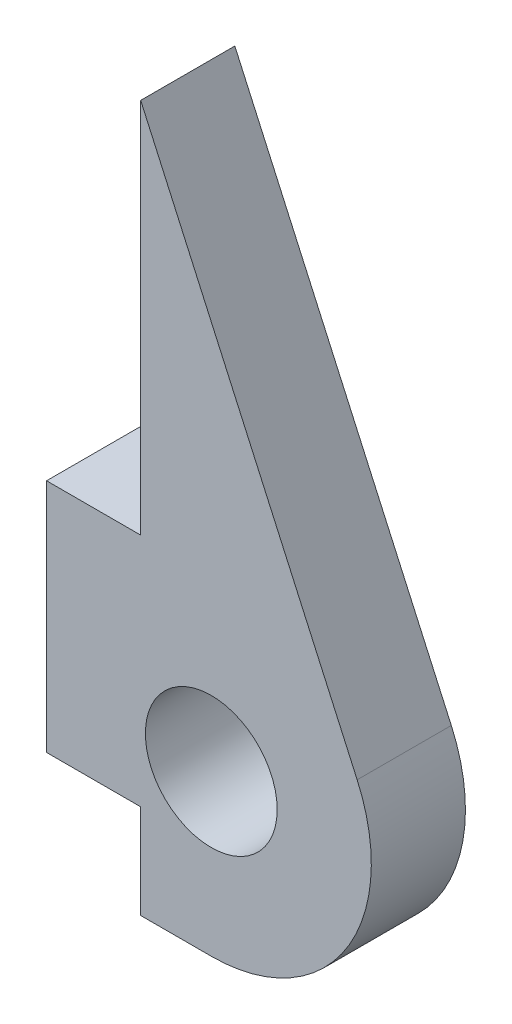
ISO-10303-21;
HEADER;
FILE_DESCRIPTION(('STEP AP214'),'2;1');
FILE_NAME('part.step','',(''),(''),'','','');
FILE_SCHEMA(('AUTOMOTIVE_DESIGN { 1 0 10303 214 1 1 1 1 }'));
ENDSEC;
DATA;
#1=APPLICATION_CONTEXT('core data for automotive mechanical design processes');
#2=APPLICATION_PROTOCOL_DEFINITION('international standard','automotive_design',2000,#1);
#3=PRODUCT_CONTEXT('',#1,'mechanical');
#4=PRODUCT('Part','Part','',(#3));
#5=PRODUCT_RELATED_PRODUCT_CATEGORY('part','',(#4));
#6=PRODUCT_DEFINITION_FORMATION('','',#4);
#7=PRODUCT_DEFINITION_CONTEXT('part definition',#1,'design');
#8=PRODUCT_DEFINITION('design','',#6,#7);
#9=PRODUCT_DEFINITION_SHAPE('','',#8);
#10=(LENGTH_UNIT() NAMED_UNIT(*) SI_UNIT(.MILLI.,.METRE.));
#11=(NAMED_UNIT(*) PLANE_ANGLE_UNIT() SI_UNIT($,.RADIAN.));
#12=(NAMED_UNIT(*) SI_UNIT($,.STERADIAN.) SOLID_ANGLE_UNIT());
#13=UNCERTAINTY_MEASURE_WITH_UNIT(LENGTH_MEASURE(1.E-05),#10,'distance_accuracy_value','');
#14=(GEOMETRIC_REPRESENTATION_CONTEXT(3) GLOBAL_UNCERTAINTY_ASSIGNED_CONTEXT((#13)) GLOBAL_UNIT_ASSIGNED_CONTEXT((#10,
#11,#12)) REPRESENTATION_CONTEXT('',''));
#15=CARTESIAN_POINT('',(0.,0.,0.));
#16=DIRECTION('',(0.,0.,1.));
#17=DIRECTION('',(1.,0.,0.));
#18=AXIS2_PLACEMENT_3D('',#15,#16,#17);
#19=CARTESIAN_POINT('',(0.,0.,2.));
#20=DIRECTION('',(0.,0.,1.));
#21=DIRECTION('',(1.,0.,0.));
#22=AXIS2_PLACEMENT_3D('',#19,#20,#21);
#23=PLANE('',#22);
#24=DIRECTION('',(0.,-1.,0.));
#25=VECTOR('',#24,1.);
#26=CARTESIAN_POINT('',(-1.5,3.6,2.));
#27=LINE('',#26,#25);
#28=CARTESIAN_POINT('',(-1.50000000000001,11.6,2.));
#29=VERTEX_POINT('',#28);
#30=CARTESIAN_POINT('',(-1.5,3.6,2.));
#31=VERTEX_POINT('',#30);
#32=EDGE_CURVE('E146',#29,#31,#27,.T.);
#33=ORIENTED_EDGE('',*,*,#32,.T.);
#34=DIRECTION('',(-1.,0.,0.));
#35=VECTOR('',#34,1.);
#36=CARTESIAN_POINT('',(-1.5,3.6,2.));
#37=LINE('',#36,#35);
#38=CARTESIAN_POINT('',(-3.49999999999999,3.6,2.));
#39=VERTEX_POINT('',#38);
#40=EDGE_CURVE('E94',#31,#39,#37,.T.);
#41=ORIENTED_EDGE('',*,*,#40,.T.);
#42=DIRECTION('',(0.,-1.,0.));
#43=VECTOR('',#42,1.);
#44=CARTESIAN_POINT('',(-3.49999999999999,3.6,2.));
#45=LINE('',#44,#43);
#46=CARTESIAN_POINT('',(-3.49999999999999,-1.4,2.));
#47=VERTEX_POINT('',#46);
#48=EDGE_CURVE('E161',#39,#47,#45,.T.);
#49=ORIENTED_EDGE('',*,*,#48,.T.);
#50=DIRECTION('',(1.,0.,0.));
#51=VECTOR('',#50,1.);
#52=CARTESIAN_POINT('',(-3.49999999999999,-1.4,2.));
#53=LINE('',#52,#51);
#54=CARTESIAN_POINT('',(-1.5,-1.4,2.));
#55=VERTEX_POINT('',#54);
#56=EDGE_CURVE('E174',#47,#55,#53,.T.);
#57=ORIENTED_EDGE('',*,*,#56,.T.);
#58=DIRECTION('',(0.,-1.,0.));
#59=VECTOR('',#58,1.);
#60=CARTESIAN_POINT('',(-1.5,-3.4,2.));
#61=LINE('',#60,#59);
#62=CARTESIAN_POINT('',(-1.5,-3.4,2.));
#63=VERTEX_POINT('',#62);
#64=EDGE_CURVE('E113',#55,#63,#61,.T.);
#65=ORIENTED_EDGE('',*,*,#64,.T.);
#66=DIRECTION('',(1.,0.,0.));
#67=VECTOR('',#66,1.);
#68=CARTESIAN_POINT('',(0.,-3.4,2.));
#69=LINE('',#68,#67);
#70=CARTESIAN_POINT('',(0.,-3.4,2.));
#71=VERTEX_POINT('',#70);
#72=EDGE_CURVE('E107',#63,#71,#69,.T.);
#73=ORIENTED_EDGE('',*,*,#72,.T.);
#74=CARTESIAN_POINT('',(0.,0.,2.));
#75=DIRECTION('',(0.,0.,1.));
#76=DIRECTION('',(1.,0.,0.));
#77=AXIS2_PLACEMENT_3D('',#74,#75,#76);
#78=CIRCLE('',#77,3.4);
#79=CARTESIAN_POINT('',(3.09957852139478,1.39735929155967,2.));
#80=VERTEX_POINT('',#79);
#81=EDGE_CURVE('E111',#71,#80,#78,.T.);
#82=ORIENTED_EDGE('',*,*,#81,.T.);
#83=DIRECTION('',(-0.410988026929315,0.9116407415867,0.));
#84=VECTOR('',#83,1.);
#85=CARTESIAN_POINT('',(-1.50000000000001,11.6,2.));
#86=LINE('',#85,#84);
#87=EDGE_CURVE('E51',#80,#29,#86,.T.);
#88=ORIENTED_EDGE('',*,*,#87,.T.);
#89=EDGE_LOOP('',(#33,#41,#49,#57,#65,#73,#82,#88));
#90=FACE_BOUND('',#89,.T.);
#91=CARTESIAN_POINT('',(0.,0.,2.));
#92=DIRECTION('',(0.,0.,1.));
#93=DIRECTION('',(1.,0.,0.));
#94=AXIS2_PLACEMENT_3D('',#91,#92,#93);
#95=CIRCLE('',#94,1.4);
#96=CARTESIAN_POINT('',(1.4,0.,2.));
#97=VERTEX_POINT('',#96);
#98=EDGE_CURVE('E135',#97,#97,#95,.T.);
#99=ORIENTED_EDGE('',*,*,#98,.F.);
#100=EDGE_LOOP('',(#99));
#101=FACE_BOUND('',#100,.T.);
#102=ADVANCED_FACE('F34',(#90,#101),#23,.T.);
#103=CARTESIAN_POINT('',(0.,0.,0.));
#104=DIRECTION('',(0.,0.,1.));
#105=DIRECTION('',(1.,0.,0.));
#106=AXIS2_PLACEMENT_3D('',#103,#104,#105);
#107=PLANE('',#106);
#108=DIRECTION('',(0.,-1.,0.));
#109=VECTOR('',#108,1.);
#110=CARTESIAN_POINT('',(-1.5,3.6,0.));
#111=LINE('',#110,#109);
#112=CARTESIAN_POINT('',(-1.50000000000001,11.6,0.));
#113=VERTEX_POINT('',#112);
#114=CARTESIAN_POINT('',(-1.5,3.6,0.));
#115=VERTEX_POINT('',#114);
#116=EDGE_CURVE('E131',#113,#115,#111,.T.);
#117=ORIENTED_EDGE('',*,*,#116,.F.);
#118=DIRECTION('',(-0.410988026929315,0.9116407415867,0.));
#119=VECTOR('',#118,1.);
#120=CARTESIAN_POINT('',(-1.50000000000001,11.6,0.));
#121=LINE('',#120,#119);
#122=CARTESIAN_POINT('',(3.09957852139478,1.39735929155967,0.));
#123=VERTEX_POINT('',#122);
#124=EDGE_CURVE('E86',#123,#113,#121,.T.);
#125=ORIENTED_EDGE('',*,*,#124,.F.);
#126=CARTESIAN_POINT('',(0.,0.,0.));
#127=DIRECTION('',(0.,0.,1.));
#128=DIRECTION('',(1.,0.,0.));
#129=AXIS2_PLACEMENT_3D('',#126,#127,#128);
#130=CIRCLE('',#129,3.4);
#131=CARTESIAN_POINT('',(0.,-3.4,0.));
#132=VERTEX_POINT('',#131);
#133=EDGE_CURVE('E80',#132,#123,#130,.T.);
#134=ORIENTED_EDGE('',*,*,#133,.F.);
#135=DIRECTION('',(1.,0.,0.));
#136=VECTOR('',#135,1.);
#137=CARTESIAN_POINT('',(0.,-3.4,0.));
#138=LINE('',#137,#136);
#139=CARTESIAN_POINT('',(-1.5,-3.4,0.));
#140=VERTEX_POINT('',#139);
#141=EDGE_CURVE('E121',#140,#132,#138,.T.);
#142=ORIENTED_EDGE('',*,*,#141,.F.);
#143=DIRECTION('',(0.,-1.,0.));
#144=VECTOR('',#143,1.);
#145=CARTESIAN_POINT('',(-1.5,-3.4,0.));
#146=LINE('',#145,#144);
#147=CARTESIAN_POINT('',(-1.5,-1.4,0.));
#148=VERTEX_POINT('',#147);
#149=EDGE_CURVE('E141',#148,#140,#146,.T.);
#150=ORIENTED_EDGE('',*,*,#149,.F.);
#151=DIRECTION('',(1.,0.,0.));
#152=VECTOR('',#151,1.);
#153=CARTESIAN_POINT('',(-3.49999999999999,-1.4,0.));
#154=LINE('',#153,#152);
#155=CARTESIAN_POINT('',(-3.49999999999999,-1.4,0.));
#156=VERTEX_POINT('',#155);
#157=EDGE_CURVE('E139',#156,#148,#154,.T.);
#158=ORIENTED_EDGE('',*,*,#157,.F.);
#159=DIRECTION('',(0.,-1.,0.));
#160=VECTOR('',#159,1.);
#161=CARTESIAN_POINT('',(-3.49999999999999,3.6,0.));
#162=LINE('',#161,#160);
#163=CARTESIAN_POINT('',(-3.49999999999999,3.6,0.));
#164=VERTEX_POINT('',#163);
#165=EDGE_CURVE('E137',#164,#156,#162,.T.);
#166=ORIENTED_EDGE('',*,*,#165,.F.);
#167=DIRECTION('',(-1.,0.,0.));
#168=VECTOR('',#167,1.);
#169=CARTESIAN_POINT('',(-1.5,3.6,0.));
#170=LINE('',#169,#168);
#171=EDGE_CURVE('E134',#115,#164,#170,.T.);
#172=ORIENTED_EDGE('',*,*,#171,.F.);
#173=EDGE_LOOP('',(#117,#125,#134,#142,#150,#158,#166,#172));
#174=FACE_BOUND('',#173,.T.);
#175=CARTESIAN_POINT('',(0.,0.,0.));
#176=DIRECTION('',(0.,0.,1.));
#177=DIRECTION('',(1.,0.,0.));
#178=AXIS2_PLACEMENT_3D('',#175,#176,#177);
#179=CIRCLE('',#178,1.4);
#180=CARTESIAN_POINT('',(1.4,0.,0.));
#181=VERTEX_POINT('',#180);
#182=EDGE_CURVE('E180',#181,#181,#179,.T.);
#183=ORIENTED_EDGE('',*,*,#182,.T.);
#184=EDGE_LOOP('',(#183));
#185=FACE_BOUND('',#184,.T.);
#186=ADVANCED_FACE('F165',(#174,#185),#107,.F.);
#187=CARTESIAN_POINT('',(-1.5,3.6,2.));
#188=DIRECTION('',(1.,0.,0.));
#189=DIRECTION('',(0.,1.,0.));
#190=AXIS2_PLACEMENT_3D('',#187,#188,#189);
#191=PLANE('',#190);
#192=ORIENTED_EDGE('',*,*,#116,.T.);
#193=DIRECTION('',(0.,0.,-1.));
#194=VECTOR('',#193,1.);
#195=CARTESIAN_POINT('',(-1.5,3.6,2.));
#196=LINE('',#195,#194);
#197=EDGE_CURVE('E11',#31,#115,#196,.T.);
#198=ORIENTED_EDGE('',*,*,#197,.F.);
#199=ORIENTED_EDGE('',*,*,#32,.F.);
#200=DIRECTION('',(0.,0.,-1.));
#201=VECTOR('',#200,1.);
#202=CARTESIAN_POINT('',(-1.50000000000001,11.6,2.));
#203=LINE('',#202,#201);
#204=EDGE_CURVE('E127',#29,#113,#203,.T.);
#205=ORIENTED_EDGE('',*,*,#204,.T.);
#206=EDGE_LOOP('',(#192,#198,#199,#205));
#207=FACE_BOUND('',#206,.T.);
#208=ADVANCED_FACE('F36',(#207),#191,.F.);
#209=CARTESIAN_POINT('',(-1.5,3.6,2.));
#210=DIRECTION('',(0.,-1.,0.));
#211=DIRECTION('',(0.,0.,-1.));
#212=AXIS2_PLACEMENT_3D('',#209,#210,#211);
#213=PLANE('',#212);
#214=ORIENTED_EDGE('',*,*,#171,.T.);
#215=DIRECTION('',(0.,0.,-1.));
#216=VECTOR('',#215,1.);
#217=CARTESIAN_POINT('',(-3.49999999999999,3.6,2.));
#218=LINE('',#217,#216);
#219=EDGE_CURVE('E43',#39,#164,#218,.T.);
#220=ORIENTED_EDGE('',*,*,#219,.F.);
#221=ORIENTED_EDGE('',*,*,#40,.F.);
#222=ORIENTED_EDGE('',*,*,#197,.T.);
#223=EDGE_LOOP('',(#214,#220,#221,#222));
#224=FACE_BOUND('',#223,.T.);
#225=ADVANCED_FACE('F208',(#224),#213,.F.);
#226=CARTESIAN_POINT('',(-3.49999999999999,3.6,2.));
#227=DIRECTION('',(1.,0.,0.));
#228=DIRECTION('',(0.,1.,0.));
#229=AXIS2_PLACEMENT_3D('',#226,#227,#228);
#230=PLANE('',#229);
#231=ORIENTED_EDGE('',*,*,#165,.T.);
#232=DIRECTION('',(0.,0.,-1.));
#233=VECTOR('',#232,1.);
#234=CARTESIAN_POINT('',(-3.49999999999999,-1.4,2.));
#235=LINE('',#234,#233);
#236=EDGE_CURVE('E153',#47,#156,#235,.T.);
#237=ORIENTED_EDGE('',*,*,#236,.F.);
#238=ORIENTED_EDGE('',*,*,#48,.F.);
#239=ORIENTED_EDGE('',*,*,#219,.T.);
#240=EDGE_LOOP('',(#231,#237,#238,#239));
#241=FACE_BOUND('',#240,.T.);
#242=ADVANCED_FACE('F159',(#241),#230,.F.);
#243=CARTESIAN_POINT('',(-3.49999999999999,-1.4,2.));
#244=DIRECTION('',(0.,1.,0.));
#245=DIRECTION('',(0.,0.,1.));
#246=AXIS2_PLACEMENT_3D('',#243,#244,#245);
#247=PLANE('',#246);
#248=ORIENTED_EDGE('',*,*,#157,.T.);
#249=DIRECTION('',(0.,0.,-1.));
#250=VECTOR('',#249,1.);
#251=CARTESIAN_POINT('',(-1.5,-1.4,2.));
#252=LINE('',#251,#250);
#253=EDGE_CURVE('E150',#55,#148,#252,.T.);
#254=ORIENTED_EDGE('',*,*,#253,.F.);
#255=ORIENTED_EDGE('',*,*,#56,.F.);
#256=ORIENTED_EDGE('',*,*,#236,.T.);
#257=EDGE_LOOP('',(#248,#254,#255,#256));
#258=FACE_BOUND('',#257,.T.);
#259=ADVANCED_FACE('F170',(#258),#247,.F.);
#260=CARTESIAN_POINT('',(-1.5,-3.4,2.));
#261=DIRECTION('',(1.,0.,0.));
#262=DIRECTION('',(0.,1.,0.));
#263=AXIS2_PLACEMENT_3D('',#260,#261,#262);
#264=PLANE('',#263);
#265=ORIENTED_EDGE('',*,*,#149,.T.);
#266=DIRECTION('',(0.,0.,-1.));
#267=VECTOR('',#266,1.);
#268=CARTESIAN_POINT('',(-1.5,-3.4,2.));
#269=LINE('',#268,#267);
#270=EDGE_CURVE('E122',#63,#140,#269,.T.);
#271=ORIENTED_EDGE('',*,*,#270,.F.);
#272=ORIENTED_EDGE('',*,*,#64,.F.);
#273=ORIENTED_EDGE('',*,*,#253,.T.);
#274=EDGE_LOOP('',(#265,#271,#272,#273));
#275=FACE_BOUND('',#274,.T.);
#276=ADVANCED_FACE('F173',(#275),#264,.F.);
#277=CARTESIAN_POINT('',(0.,-3.4,2.));
#278=DIRECTION('',(0.,1.,0.));
#279=DIRECTION('',(0.,0.,1.));
#280=AXIS2_PLACEMENT_3D('',#277,#278,#279);
#281=PLANE('',#280);
#282=ORIENTED_EDGE('',*,*,#141,.T.);
#283=DIRECTION('',(0.,0.,-1.));
#284=VECTOR('',#283,1.);
#285=CARTESIAN_POINT('',(0.,-3.4,2.));
#286=LINE('',#285,#284);
#287=EDGE_CURVE('E118',#71,#132,#286,.T.);
#288=ORIENTED_EDGE('',*,*,#287,.F.);
#289=ORIENTED_EDGE('',*,*,#72,.F.);
#290=ORIENTED_EDGE('',*,*,#270,.T.);
#291=EDGE_LOOP('',(#282,#288,#289,#290));
#292=FACE_BOUND('',#291,.T.);
#293=ADVANCED_FACE('F119',(#292),#281,.F.);
#294=CARTESIAN_POINT('',(0.,0.,2.));
#295=DIRECTION('',(0.,0.,-1.));
#296=DIRECTION('',(-1.,0.,0.));
#297=AXIS2_PLACEMENT_3D('',#294,#295,#296);
#298=CYLINDRICAL_SURFACE('',#297,3.4);
#299=ORIENTED_EDGE('',*,*,#133,.T.);
#300=DIRECTION('',(0.,0.,-1.));
#301=VECTOR('',#300,1.);
#302=CARTESIAN_POINT('',(3.09957852139478,1.39735929155967,2.));
#303=LINE('',#302,#301);
#304=EDGE_CURVE('E123',#80,#123,#303,.T.);
#305=ORIENTED_EDGE('',*,*,#304,.F.);
#306=ORIENTED_EDGE('',*,*,#81,.F.);
#307=ORIENTED_EDGE('',*,*,#287,.T.);
#308=EDGE_LOOP('',(#299,#305,#306,#307));
#309=FACE_BOUND('',#308,.T.);
#310=ADVANCED_FACE('F125',(#309),#298,.T.);
#311=CARTESIAN_POINT('',(-1.50000000000001,11.6,2.));
#312=DIRECTION('',(-0.9116407415867,-0.410988026929315,0.));
#313=DIRECTION('',(0.410988026929315,-0.9116407415867,0.));
#314=AXIS2_PLACEMENT_3D('',#311,#312,#313);
#315=PLANE('',#314);
#316=ORIENTED_EDGE('',*,*,#124,.T.);
#317=ORIENTED_EDGE('',*,*,#204,.F.);
#318=ORIENTED_EDGE('',*,*,#87,.F.);
#319=ORIENTED_EDGE('',*,*,#304,.T.);
#320=EDGE_LOOP('',(#316,#317,#318,#319));
#321=FACE_BOUND('',#320,.T.);
#322=ADVANCED_FACE('F196',(#321),#315,.F.);
#323=CARTESIAN_POINT('',(0.,0.,2.));
#324=DIRECTION('',(0.,0.,-1.));
#325=DIRECTION('',(-1.,0.,0.));
#326=AXIS2_PLACEMENT_3D('',#323,#324,#325);
#327=CYLINDRICAL_SURFACE('',#326,1.4);
#328=ORIENTED_EDGE('',*,*,#98,.T.);
#329=EDGE_LOOP('',(#328));
#330=FACE_BOUND('',#329,.T.);
#331=ORIENTED_EDGE('',*,*,#182,.F.);
#332=EDGE_LOOP('',(#331));
#333=FACE_BOUND('',#332,.T.);
#334=ADVANCED_FACE('F186',(#330,#333),#327,.F.);
#335=CLOSED_SHELL('',(#102,#186,#208,#225,#242,#259,#276,#293,#310,#322,#334));
#336=MANIFOLD_SOLID_BREP('B2',#335);
#337=ADVANCED_BREP_SHAPE_REPRESENTATION('',(#18,#336),#14);
#338=SHAPE_DEFINITION_REPRESENTATION(#9,#337);
ENDSEC;
END-ISO-10303-21;
